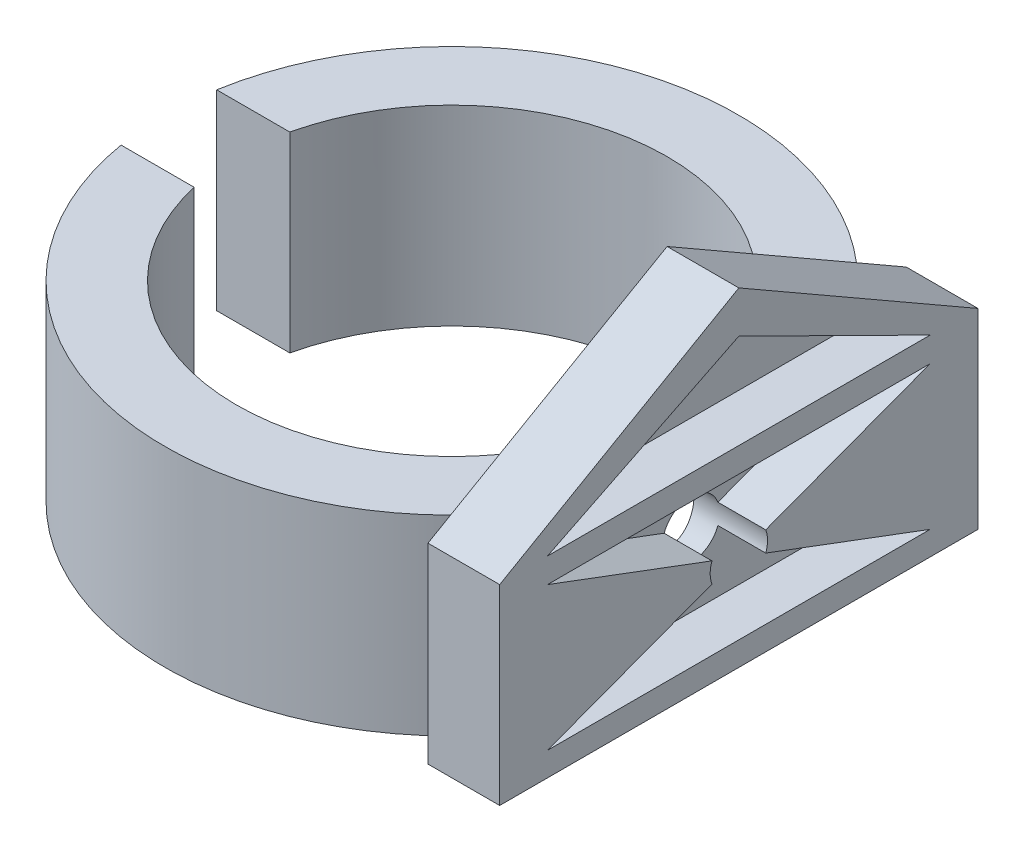
ISO-10303-21;
HEADER;
FILE_DESCRIPTION(('STEP AP214'),'2;1');
FILE_NAME('part.step','',(''),(''),'','','');
FILE_SCHEMA(('AUTOMOTIVE_DESIGN { 1 0 10303 214 1 1 1 1 }'));
ENDSEC;
DATA;
#1=APPLICATION_CONTEXT('core data for automotive mechanical design processes');
#2=APPLICATION_PROTOCOL_DEFINITION('international standard','automotive_design',2000,#1);
#3=PRODUCT_CONTEXT('',#1,'mechanical');
#4=PRODUCT('Part','Part','',(#3));
#5=PRODUCT_RELATED_PRODUCT_CATEGORY('part','',(#4));
#6=PRODUCT_DEFINITION_FORMATION('','',#4);
#7=PRODUCT_DEFINITION_CONTEXT('part definition',#1,'design');
#8=PRODUCT_DEFINITION('design','',#6,#7);
#9=PRODUCT_DEFINITION_SHAPE('','',#8);
#10=(LENGTH_UNIT() NAMED_UNIT(*) SI_UNIT(.MILLI.,.METRE.));
#11=(NAMED_UNIT(*) PLANE_ANGLE_UNIT() SI_UNIT($,.RADIAN.));
#12=(NAMED_UNIT(*) SI_UNIT($,.STERADIAN.) SOLID_ANGLE_UNIT());
#13=UNCERTAINTY_MEASURE_WITH_UNIT(LENGTH_MEASURE(1.E-05),#10,'distance_accuracy_value','');
#14=(GEOMETRIC_REPRESENTATION_CONTEXT(3) GLOBAL_UNCERTAINTY_ASSIGNED_CONTEXT((#13)) GLOBAL_UNIT_ASSIGNED_CONTEXT((#10,
#11,#12)) REPRESENTATION_CONTEXT('',''));
#15=CARTESIAN_POINT('',(0.,0.,0.));
#16=DIRECTION('',(0.,0.,1.));
#17=DIRECTION('',(1.,0.,0.));
#18=AXIS2_PLACEMENT_3D('',#15,#16,#17);
#19=CARTESIAN_POINT('',(0.,20.,0.));
#20=DIRECTION('',(0.,1.,0.));
#21=DIRECTION('',(0.,0.,1.));
#22=AXIS2_PLACEMENT_3D('',#19,#20,#21);
#23=PLANE('',#22);
#24=CARTESIAN_POINT('',(0.,20.,0.));
#25=DIRECTION('',(0.,1.,0.));
#26=DIRECTION('',(0.,0.,1.));
#27=AXIS2_PLACEMENT_3D('',#24,#25,#26);
#28=CIRCLE('',#27,30.);
#29=CARTESIAN_POINT('',(-29.5803989154981,20.,5.));
#30=VERTEX_POINT('',#29);
#31=CARTESIAN_POINT('',(22.5,20.,19.8431348329844));
#32=VERTEX_POINT('',#31);
#33=EDGE_CURVE('E356',#30,#32,#28,.T.);
#34=ORIENTED_EDGE('',*,*,#33,.T.);
#35=DIRECTION('',(0.,0.,-1.));
#36=VECTOR('',#35,1.);
#37=CARTESIAN_POINT('',(22.5,20.,25.));
#38=LINE('',#37,#36);
#39=CARTESIAN_POINT('',(22.5,20.,0.));
#40=VERTEX_POINT('',#39);
#41=EDGE_CURVE('E11',#32,#40,#38,.T.);
#42=ORIENTED_EDGE('',*,*,#41,.T.);
#43=CARTESIAN_POINT('',(0.,20.,0.));
#44=DIRECTION('',(0.,1.,0.));
#45=DIRECTION('',(0.,0.,1.));
#46=AXIS2_PLACEMENT_3D('',#43,#44,#45);
#47=CIRCLE('',#46,22.5);
#48=CARTESIAN_POINT('',(-21.9374109684803,20.,5.));
#49=VERTEX_POINT('',#48);
#50=EDGE_CURVE('E361',#49,#40,#47,.T.);
#51=ORIENTED_EDGE('',*,*,#50,.F.);
#52=DIRECTION('',(1.,0.,0.));
#53=VECTOR('',#52,1.);
#54=CARTESIAN_POINT('',(-33.9901992769391,20.,5.));
#55=LINE('',#54,#53);
#56=EDGE_CURVE('E391',#30,#49,#55,.T.);
#57=ORIENTED_EDGE('',*,*,#56,.F.);
#58=EDGE_LOOP('',(#34,#42,#51,#57));
#59=FACE_BOUND('',#58,.T.);
#60=ADVANCED_FACE('F32',(#59),#23,.T.);
#61=CARTESIAN_POINT('',(-21.9374109684803,20.,-5.));
#62=VERTEX_POINT('',#61);
#63=EDGE_CURVE('E375',#40,#62,#47,.T.);
#64=ORIENTED_EDGE('',*,*,#63,.F.);
#65=CARTESIAN_POINT('',(22.5,20.,-19.8431348329844));
#66=VERTEX_POINT('',#65);
#67=EDGE_CURVE('E41',#40,#66,#38,.T.);
#68=ORIENTED_EDGE('',*,*,#67,.T.);
#69=CARTESIAN_POINT('',(-29.5803989154981,20.,-5.));
#70=VERTEX_POINT('',#69);
#71=EDGE_CURVE('E359',#66,#70,#28,.T.);
#72=ORIENTED_EDGE('',*,*,#71,.T.);
#73=DIRECTION('',(-1.,0.,0.));
#74=VECTOR('',#73,1.);
#75=CARTESIAN_POINT('',(-33.9901992769391,20.,-5.));
#76=LINE('',#75,#74);
#77=EDGE_CURVE('E390',#62,#70,#76,.T.);
#78=ORIENTED_EDGE('',*,*,#77,.F.);
#79=EDGE_LOOP('',(#64,#68,#72,#78));
#80=FACE_BOUND('',#79,.T.);
#81=ADVANCED_FACE('F320',(#80),#23,.T.);
#82=CARTESIAN_POINT('',(25.,0.,0.));
#83=DIRECTION('',(1.,0.,0.));
#84=DIRECTION('',(0.,0.,-1.));
#85=AXIS2_PLACEMENT_3D('',#82,#83,#84);
#86=PLANE('',#85);
#87=CARTESIAN_POINT('',(25.,10.,-2.09488880330588E-13));
#88=DIRECTION('',(1.,0.,0.));
#89=DIRECTION('',(0.,0.,-1.));
#90=AXIS2_PLACEMENT_3D('',#87,#88,#89);
#91=CIRCLE('',#90,3.);
#92=CARTESIAN_POINT('',(25.,11.0533703247652,-2.80898753270732));
#93=VERTEX_POINT('',#92);
#94=CARTESIAN_POINT('',(25.,11.0533703247651,2.80898753270695));
#95=VERTEX_POINT('',#94);
#96=EDGE_CURVE('E368',#93,#95,#91,.T.);
#97=ORIENTED_EDGE('',*,*,#96,.F.);
#98=DIRECTION('',(0.,0.351123441588392,-0.936329177569044));
#99=VECTOR('',#98,1.);
#100=CARTESIAN_POINT('',(25.,17.5,-20.));
#101=LINE('',#100,#99);
#102=CARTESIAN_POINT('',(25.,17.5,-20.));
#103=VERTEX_POINT('',#102);
#104=EDGE_CURVE('E614',#93,#103,#101,.T.);
#105=ORIENTED_EDGE('',*,*,#104,.T.);
#106=DIRECTION('',(0.,0.,1.));
#107=VECTOR('',#106,1.);
#108=CARTESIAN_POINT('',(25.,17.5,-20.));
#109=LINE('',#108,#107);
#110=CARTESIAN_POINT('',(25.,17.5,20.));
#111=VERTEX_POINT('',#110);
#112=EDGE_CURVE('E621',#103,#111,#109,.T.);
#113=ORIENTED_EDGE('',*,*,#112,.T.);
#114=DIRECTION('',(0.,-0.351123441588391,-0.936329177569045));
#115=VECTOR('',#114,1.);
#116=CARTESIAN_POINT('',(25.,10.375,1.));
#117=LINE('',#116,#115);
#118=EDGE_CURVE('E251',#111,#95,#117,.T.);
#119=ORIENTED_EDGE('',*,*,#118,.T.);
#120=EDGE_LOOP('',(#97,#105,#113,#119));
#121=FACE_BOUND('',#120,.T.);
#122=ADVANCED_FACE('F271',(#121),#86,.T.);
#123=CARTESIAN_POINT('',(0.,20.,0.));
#124=DIRECTION('',(0.,-1.,0.));
#125=DIRECTION('',(0.,0.,-1.));
#126=AXIS2_PLACEMENT_3D('',#123,#124,#125);
#127=CYLINDRICAL_SURFACE('',#126,30.);
#128=DIRECTION('',(0.,-1.,0.));
#129=VECTOR('',#128,1.);
#130=CARTESIAN_POINT('',(-29.5803989154981,20.,-5.));
#131=LINE('',#130,#129);
#132=CARTESIAN_POINT('',(-29.5803989154981,0.,-5.));
#133=VERTEX_POINT('',#132);
#134=EDGE_CURVE('E353',#70,#133,#131,.T.);
#135=ORIENTED_EDGE('',*,*,#134,.F.);
#136=ORIENTED_EDGE('',*,*,#71,.F.);
#137=DIRECTION('',(0.,-1.,0.));
#138=VECTOR('',#137,1.);
#139=CARTESIAN_POINT('',(22.5,20.,-19.8431348329844));
#140=LINE('',#139,#138);
#141=CARTESIAN_POINT('',(22.5,0.,-19.8431348329844));
#142=VERTEX_POINT('',#141);
#143=EDGE_CURVE('E355',#142,#66,#140,.F.);
#144=ORIENTED_EDGE('',*,*,#143,.F.);
#145=CARTESIAN_POINT('',(0.,0.,0.));
#146=DIRECTION('',(0.,1.,0.));
#147=DIRECTION('',(0.,0.,1.));
#148=AXIS2_PLACEMENT_3D('',#145,#146,#147);
#149=CIRCLE('',#148,30.);
#150=EDGE_CURVE('E340',#142,#133,#149,.T.);
#151=ORIENTED_EDGE('',*,*,#150,.T.);
#152=EDGE_LOOP('',(#135,#136,#144,#151));
#153=FACE_BOUND('',#152,.T.);
#154=ADVANCED_FACE('F34',(#153),#127,.T.);
#155=DIRECTION('',(0.,-1.,0.));
#156=VECTOR('',#155,1.);
#157=CARTESIAN_POINT('',(-29.5803989154981,20.,5.));
#158=LINE('',#157,#156);
#159=CARTESIAN_POINT('',(-29.5803989154981,0.,5.));
#160=VERTEX_POINT('',#159);
#161=EDGE_CURVE('E393',#160,#30,#158,.F.);
#162=ORIENTED_EDGE('',*,*,#161,.F.);
#163=CARTESIAN_POINT('',(22.5,0.,19.8431348329844));
#164=VERTEX_POINT('',#163);
#165=EDGE_CURVE('E357',#160,#164,#149,.T.);
#166=ORIENTED_EDGE('',*,*,#165,.T.);
#167=DIRECTION('',(0.,-1.,0.));
#168=VECTOR('',#167,1.);
#169=CARTESIAN_POINT('',(22.5,20.,19.8431348329844));
#170=LINE('',#169,#168);
#171=EDGE_CURVE('E381',#32,#164,#170,.T.);
#172=ORIENTED_EDGE('',*,*,#171,.F.);
#173=ORIENTED_EDGE('',*,*,#33,.F.);
#174=EDGE_LOOP('',(#162,#166,#172,#173));
#175=FACE_BOUND('',#174,.T.);
#176=ADVANCED_FACE('F327',(#175),#127,.T.);
#177=CARTESIAN_POINT('',(0.,0.,0.));
#178=DIRECTION('',(0.,1.,0.));
#179=DIRECTION('',(0.,0.,1.));
#180=AXIS2_PLACEMENT_3D('',#177,#178,#179);
#181=PLANE('',#180);
#182=DIRECTION('',(-1.,0.,0.));
#183=VECTOR('',#182,1.);
#184=CARTESIAN_POINT('',(-33.9901992769391,0.,-5.));
#185=LINE('',#184,#183);
#186=CARTESIAN_POINT('',(-21.9374109684803,0.,-5.));
#187=VERTEX_POINT('',#186);
#188=EDGE_CURVE('E338',#187,#133,#185,.T.);
#189=ORIENTED_EDGE('',*,*,#188,.T.);
#190=ORIENTED_EDGE('',*,*,#150,.F.);
#191=DIRECTION('',(0.,0.,-1.));
#192=VECTOR('',#191,1.);
#193=CARTESIAN_POINT('',(22.5,0.,25.));
#194=LINE('',#193,#192);
#195=CARTESIAN_POINT('',(22.5,0.,-25.));
#196=VERTEX_POINT('',#195);
#197=EDGE_CURVE('E380',#142,#196,#194,.T.);
#198=ORIENTED_EDGE('',*,*,#197,.T.);
#199=DIRECTION('',(-1.,0.,0.));
#200=VECTOR('',#199,1.);
#201=CARTESIAN_POINT('',(30.,0.,-25.));
#202=LINE('',#201,#200);
#203=CARTESIAN_POINT('',(30.,0.,-25.));
#204=VERTEX_POINT('',#203);
#205=EDGE_CURVE('E410',#204,#196,#202,.T.);
#206=ORIENTED_EDGE('',*,*,#205,.F.);
#207=DIRECTION('',(0.,0.,-1.));
#208=VECTOR('',#207,1.);
#209=CARTESIAN_POINT('',(30.,0.,25.));
#210=LINE('',#209,#208);
#211=CARTESIAN_POINT('',(30.,0.,25.));
#212=VERTEX_POINT('',#211);
#213=EDGE_CURVE('E408',#212,#204,#210,.T.);
#214=ORIENTED_EDGE('',*,*,#213,.F.);
#215=DIRECTION('',(-1.,0.,0.));
#216=VECTOR('',#215,1.);
#217=CARTESIAN_POINT('',(30.,0.,25.));
#218=LINE('',#217,#216);
#219=CARTESIAN_POINT('',(22.5,0.,25.));
#220=VERTEX_POINT('',#219);
#221=EDGE_CURVE('E418',#212,#220,#218,.T.);
#222=ORIENTED_EDGE('',*,*,#221,.T.);
#223=EDGE_CURVE('E406',#220,#164,#194,.T.);
#224=ORIENTED_EDGE('',*,*,#223,.T.);
#225=ORIENTED_EDGE('',*,*,#165,.F.);
#226=DIRECTION('',(1.,0.,0.));
#227=VECTOR('',#226,1.);
#228=CARTESIAN_POINT('',(-33.9901992769391,0.,5.));
#229=LINE('',#228,#227);
#230=CARTESIAN_POINT('',(-21.9374109684803,0.,5.));
#231=VERTEX_POINT('',#230);
#232=EDGE_CURVE('E347',#160,#231,#229,.T.);
#233=ORIENTED_EDGE('',*,*,#232,.T.);
#234=CARTESIAN_POINT('',(0.,0.,0.));
#235=DIRECTION('',(0.,1.,0.));
#236=DIRECTION('',(0.,0.,1.));
#237=AXIS2_PLACEMENT_3D('',#234,#235,#236);
#238=CIRCLE('',#237,22.5);
#239=EDGE_CURVE('E344',#231,#187,#238,.T.);
#240=ORIENTED_EDGE('',*,*,#239,.T.);
#241=EDGE_LOOP('',(#189,#190,#198,#206,#214,#222,#224,#225,#233,#240));
#242=FACE_BOUND('',#241,.T.);
#243=ADVANCED_FACE('F325',(#242),#181,.F.);
#244=CARTESIAN_POINT('',(0.,20.,0.));
#245=DIRECTION('',(0.,-1.,0.));
#246=DIRECTION('',(0.,0.,-1.));
#247=AXIS2_PLACEMENT_3D('',#244,#245,#246);
#248=CYLINDRICAL_SURFACE('',#247,22.5);
#249=CARTESIAN_POINT('',(22.2991031209777,10.,-3.00000000000021));
#250=CARTESIAN_POINT('',(22.2991056676806,9.83229421679777,-2.99999292892204));
#251=CARTESIAN_POINT('',(22.3010154696116,9.66448595032542,-2.98588990056224));
#252=CARTESIAN_POINT('',(22.3084447289533,9.33354630649642,-2.92985694399204));
#253=CARTESIAN_POINT('',(22.3139678794925,9.17041989262426,-2.88789854473687));
#254=CARTESIAN_POINT('',(22.3279873821811,8.85368294766046,-2.7774196671042));
#255=CARTESIAN_POINT('',(22.3364816334313,8.70006578257344,-2.70891795412589));
#256=CARTESIAN_POINT('',(22.3554837337772,8.40653338643568,-2.5473384732105));
#257=CARTESIAN_POINT('',(22.3659912596801,8.26661596159296,-2.45426464895224));
#258=CARTESIAN_POINT('',(22.3879106598111,8.00353981799729,-2.24555055734298));
#259=CARTESIAN_POINT('',(22.399327327406,7.88048070148093,-2.1297852341231));
#260=CARTESIAN_POINT('',(22.4217356438735,7.65547563181543,-1.87924384308936));
#261=CARTESIAN_POINT('',(22.4327272708986,7.55353076278571,-1.74446679970818));
#262=CARTESIAN_POINT('',(22.4530964964055,7.37328723742539,-1.45909758739163));
#263=CARTESIAN_POINT('',(22.4624678475342,7.29507926606463,-1.30844765656704));
#264=CARTESIAN_POINT('',(22.4784878012371,7.1651107537288,-0.996005724056261));
#265=CARTESIAN_POINT('',(22.4851365182189,7.11334910143348,-0.834214190883811));
#266=CARTESIAN_POINT('',(22.4949282929341,7.0380416356296,-0.505103062521344));
#267=CARTESIAN_POINT('',(22.4980919730761,7.01432977748207,-0.337822085205056));
#268=CARTESIAN_POINT('',(22.5006277195728,6.99528008689477,-0.00162750345569448));
#269=CARTESIAN_POINT('',(22.4999999544425,6.99994099339522,0.16728602808349));
#270=CARTESIAN_POINT('',(22.4950401617536,7.03737209581142,0.500820186698445));
#271=CARTESIAN_POINT('',(22.4907316700671,7.06996369711847,0.665461256042468));
#272=CARTESIAN_POINT('',(22.4789208613843,7.16205149053226,0.986916184068623));
#273=CARTESIAN_POINT('',(22.4714184767105,7.22154825275217,1.14372987681255));
#274=CARTESIAN_POINT('',(22.4540222850625,7.36594516168273,1.44562771263598));
#275=CARTESIAN_POINT('',(22.4441212821882,7.45092193477462,1.59067477402968));
#276=CARTESIAN_POINT('',(22.4230342562856,7.64381088592428,1.86451753610197));
#277=CARTESIAN_POINT('',(22.4118481662644,7.7517242599417,1.99331238880002));
#278=CARTESIAN_POINT('',(22.3893388214349,7.98842177253839,2.23204509231787));
#279=CARTESIAN_POINT('',(22.378015176366,8.11736165229045,2.34182855029511));
#280=CARTESIAN_POINT('',(22.3565924815386,8.39191889705886,2.53822039585766));
#281=CARTESIAN_POINT('',(22.3464934366361,8.53753632820445,2.62482869154509));
#282=CARTESIAN_POINT('',(22.3286636450151,8.84146000052005,2.77242429129729));
#283=CARTESIAN_POINT('',(22.3209341432218,8.99977285677773,2.83339813360039));
#284=CARTESIAN_POINT('',(22.3087421319858,9.32451703095756,2.92785135067365));
#285=CARTESIAN_POINT('',(22.3042794425425,9.49094790103984,2.96133224031194));
#286=CARTESIAN_POINT('',(22.2991596751552,9.82583700250744,2.9996424115307));
#287=CARTESIAN_POINT('',(22.2984736726745,9.9942698954988,3.00468946648197));
#288=CARTESIAN_POINT('',(22.3009083644505,10.3295788841571,2.98656432283173));
#289=CARTESIAN_POINT('',(22.3040289660713,10.4964550176092,2.96339281094644));
#290=CARTESIAN_POINT('',(22.3136988065516,10.8232539796084,2.88967207555508));
#291=CARTESIAN_POINT('',(22.3202347168148,10.9832012395272,2.83922925485019));
#292=CARTESIAN_POINT('',(22.3359878852161,11.2923683701787,2.71250767620167));
#293=CARTESIAN_POINT('',(22.3452052497427,11.4415878149856,2.63622789314054));
#294=CARTESIAN_POINT('',(22.3653516992928,11.7260459656612,2.45946609625795));
#295=CARTESIAN_POINT('',(22.376290706837,11.8611955725524,2.3588418474943));
#296=CARTESIAN_POINT('',(22.3986171527477,12.1127664076556,2.13644748469177));
#297=CARTESIAN_POINT('',(22.410004610999,12.229186804222,2.0146764321561));
#298=CARTESIAN_POINT('',(22.43203422983,12.4407648308817,1.75249132253715));
#299=CARTESIAN_POINT('',(22.4426710507458,12.5357789745574,1.61196096139858));
#300=CARTESIAN_POINT('',(22.4619201221746,12.700852423263,1.31680867847622));
#301=CARTESIAN_POINT('',(22.4705324182274,12.7709122896342,1.16218707377034));
#302=CARTESIAN_POINT('',(22.4847384703673,12.8838538923822,0.843709158784941));
#303=CARTESIAN_POINT('',(22.4903412723117,12.9268171436253,0.679882176370834));
#304=CARTESIAN_POINT('',(22.4979347502993,12.9846107281915,0.347259740134587));
#305=CARTESIAN_POINT('',(22.499925612842,12.9994425140616,0.178464543299523));
#306=CARTESIAN_POINT('',(22.5000697087262,13.0005224008605,-0.157904810567589));
#307=CARTESIAN_POINT('',(22.4982525737009,12.9869912058916,-0.325478288883018));
#308=CARTESIAN_POINT('',(22.4910439982984,12.932198438152,-0.655946164578749));
#309=CARTESIAN_POINT('',(22.485652562927,12.890936904218,-0.818840568511819));
#310=CARTESIAN_POINT('',(22.4718983496352,12.7819269293851,-1.13528735188346));
#311=CARTESIAN_POINT('',(22.4635369261179,12.7141905603882,-1.28884395231592));
#312=CARTESIAN_POINT('',(22.4447662409466,12.5541766755311,-1.58244611794667));
#313=CARTESIAN_POINT('',(22.4343569414803,12.4618987065202,-1.72249143359952));
#314=CARTESIAN_POINT('',(22.4125543681221,12.2546099769957,-1.98622092909975));
#315=CARTESIAN_POINT('',(22.4011543544026,12.1394353147957,-2.10977573574409));
#316=CARTESIAN_POINT('',(22.3787079735476,11.8899653964245,-2.33588843381057));
#317=CARTESIAN_POINT('',(22.3676616905097,11.7556656341014,-2.43844136296158));
#318=CARTESIAN_POINT('',(22.3471216479154,11.4710740876578,-2.62003186467137));
#319=CARTESIAN_POINT('',(22.337634925064,11.3207146127921,-2.69896410641032));
#320=CARTESIAN_POINT('',(22.3213704974611,11.0088272987819,-2.83034277419589));
#321=CARTESIAN_POINT('',(22.3145898900774,10.8473116453756,-2.8828175949895));
#322=CARTESIAN_POINT('',(22.3061270075485,10.5708275819042,-2.94743220568259));
#323=CARTESIAN_POINT('',(22.3035064293224,10.4575925905458,-2.96711622203823));
#324=CARTESIAN_POINT('',(22.2999936221278,10.2295877357963,-2.99340248014695));
#325=CARTESIAN_POINT('',(22.2991013774062,10.1148178864045,-3.00000484113469));
#326=CARTESIAN_POINT('',(22.2991031209777,10.,-3.00000000000021));
#327=B_SPLINE_CURVE_WITH_KNOTS('',3,(#249,#250,#251,#252,#253,#254,#255,#256,#257,#258,#259,
#260,#261,#262,#263,#264,#265,#266,#267,#268,#269,#270,#271,#272,#273,#274,#275,#276,#277,#278,
#279,#280,#281,#282,#283,#284,#285,#286,#287,#288,#289,#290,#291,#292,#293,#294,#295,#296,#297,
#298,#299,#300,#301,#302,#303,#304,#305,#306,#307,#308,#309,#310,#311,#312,#313,#314,#315,#316,
#317,#318,#319,#320,#321,#322,#323,#324,#325,#326),.UNSPECIFIED.,.T.,.F.,(4,2,2,2,2,2,2,2,2,2,2,
2,2,2,2,2,2,2,2,2,2,2,2,2,2,2,2,2,2,2,2,2,2,2,2,2,2,2,4),(0.,0.502697833875671,1.00591026915852,
1.50876759415237,2.01154426252434,2.51717392681748,3.02282954643357,3.5303933478772,
4.03793581885392,4.54245854287453,5.04695884297285,5.54825713004929,6.04956604000018,
6.55239792684377,7.05525603876943,7.56202372603438,8.06879342278636,8.57582891483611,
9.08283646723652,9.58595553872895,10.0890623667531,10.5902202722789,11.0913980642731,
11.595577922135,12.0997801612593,12.6072676764676,13.1147437751273,13.620685856555,
14.1266018133322,14.6285956478445,15.1305887793096,15.6323532802529,16.1341270467162,
16.6396311355341,17.145254526141,17.6531001297407,18.1603995347189,18.5045691141841,
18.8487355566504),.UNSPECIFIED.);
#328=CARTESIAN_POINT('',(22.2991031209777,10.,-3.00000000000021));
#329=VERTEX_POINT('',#328);
#330=EDGE_CURVE('E243',#329,#329,#327,.T.);
#331=ORIENTED_EDGE('',*,*,#330,.F.);
#332=EDGE_LOOP('',(#331));
#333=FACE_BOUND('',#332,.T.);
#334=ORIENTED_EDGE('',*,*,#50,.T.);
#335=ORIENTED_EDGE('',*,*,#63,.T.);
#336=DIRECTION('',(0.,-1.,0.));
#337=VECTOR('',#336,1.);
#338=CARTESIAN_POINT('',(-21.9374109684803,20.,-5.));
#339=LINE('',#338,#337);
#340=EDGE_CURVE('E366',#62,#187,#339,.T.);
#341=ORIENTED_EDGE('',*,*,#340,.T.);
#342=ORIENTED_EDGE('',*,*,#239,.F.);
#343=DIRECTION('',(0.,-1.,0.));
#344=VECTOR('',#343,1.);
#345=CARTESIAN_POINT('',(-21.9374109684803,20.,5.));
#346=LINE('',#345,#344);
#347=EDGE_CURVE('E364',#231,#49,#346,.F.);
#348=ORIENTED_EDGE('',*,*,#347,.T.);
#349=EDGE_LOOP('',(#334,#335,#341,#342,#348));
#350=FACE_BOUND('',#349,.T.);
#351=ADVANCED_FACE('F253',(#333,#350),#248,.F.);
#352=CARTESIAN_POINT('',(30.,0.,0.));
#353=DIRECTION('',(1.,0.,0.));
#354=DIRECTION('',(0.,0.,-1.));
#355=AXIS2_PLACEMENT_3D('',#352,#353,#354);
#356=PLANE('',#355);
#357=DIRECTION('',(0.,-0.443717317072408,0.896166805081545));
#358=VECTOR('',#357,1.);
#359=CARTESIAN_POINT('',(30.,29.9909641759337,0.));
#360=LINE('',#359,#358);
#361=CARTESIAN_POINT('',(30.,29.9909641759337,0.));
#362=VERTEX_POINT('',#361);
#363=CARTESIAN_POINT('',(30.,20.0884033009629,20.));
#364=VERTEX_POINT('',#363);
#365=EDGE_CURVE('E49',#362,#364,#360,.T.);
#366=ORIENTED_EDGE('',*,*,#365,.F.);
#367=DIRECTION('',(0.,0.443717317072408,0.896166805081545));
#368=VECTOR('',#367,1.);
#369=CARTESIAN_POINT('',(30.,20.0884033009629,-20.));
#370=LINE('',#369,#368);
#371=CARTESIAN_POINT('',(30.,20.0884033009629,-20.));
#372=VERTEX_POINT('',#371);
#373=EDGE_CURVE('E202',#372,#362,#370,.T.);
#374=ORIENTED_EDGE('',*,*,#373,.F.);
#375=DIRECTION('',(0.,0.,-1.));
#376=VECTOR('',#375,1.);
#377=CARTESIAN_POINT('',(30.,20.0884033009629,20.));
#378=LINE('',#377,#376);
#379=EDGE_CURVE('E205',#364,#372,#378,.T.);
#380=ORIENTED_EDGE('',*,*,#379,.F.);
#381=EDGE_LOOP('',(#366,#374,#380));
#382=FACE_BOUND('',#381,.T.);
#383=CARTESIAN_POINT('',(30.,10.,-2.09488880330588E-13));
#384=DIRECTION('',(1.,0.,0.));
#385=DIRECTION('',(0.,0.,-1.));
#386=AXIS2_PLACEMENT_3D('',#383,#384,#385);
#387=CIRCLE('',#386,3.);
#388=CARTESIAN_POINT('',(30.,11.0533703247651,2.80898753270695));
#389=VERTEX_POINT('',#388);
#390=CARTESIAN_POINT('',(30.,8.94662967523489,2.80898753270695));
#391=VERTEX_POINT('',#390);
#392=EDGE_CURVE('E230',#389,#391,#387,.T.);
#393=ORIENTED_EDGE('',*,*,#392,.F.);
#394=DIRECTION('',(0.,-0.351123441588391,-0.936329177569045));
#395=VECTOR('',#394,1.);
#396=CARTESIAN_POINT('',(30.,10.375,1.));
#397=LINE('',#396,#395);
#398=CARTESIAN_POINT('',(30.,17.5,20.));
#399=VERTEX_POINT('',#398);
#400=EDGE_CURVE('E250',#399,#389,#397,.T.);
#401=ORIENTED_EDGE('',*,*,#400,.F.);
#402=DIRECTION('',(0.,0.,1.));
#403=VECTOR('',#402,1.);
#404=CARTESIAN_POINT('',(30.,17.5,-20.));
#405=LINE('',#404,#403);
#406=CARTESIAN_POINT('',(30.,17.5,-20.));
#407=VERTEX_POINT('',#406);
#408=EDGE_CURVE('E642',#407,#399,#405,.T.);
#409=ORIENTED_EDGE('',*,*,#408,.F.);
#410=DIRECTION('',(0.,0.351123441588392,-0.936329177569044));
#411=VECTOR('',#410,1.);
#412=CARTESIAN_POINT('',(30.,17.5,-20.));
#413=LINE('',#412,#411);
#414=CARTESIAN_POINT('',(30.,11.0533703247652,-2.80898753270732));
#415=VERTEX_POINT('',#414);
#416=EDGE_CURVE('E640',#415,#407,#413,.T.);
#417=ORIENTED_EDGE('',*,*,#416,.F.);
#418=CARTESIAN_POINT('',(30.,8.94662967523475,-2.80898753270732));
#419=VERTEX_POINT('',#418);
#420=EDGE_CURVE('E228',#419,#415,#387,.T.);
#421=ORIENTED_EDGE('',*,*,#420,.F.);
#422=DIRECTION('',(0.,0.351123441588391,0.936329177569045));
#423=VECTOR('',#422,1.);
#424=CARTESIAN_POINT('',(30.,2.5,-20.));
#425=LINE('',#424,#423);
#426=CARTESIAN_POINT('',(30.,2.5,-20.));
#427=VERTEX_POINT('',#426);
#428=EDGE_CURVE('E637',#427,#419,#425,.T.);
#429=ORIENTED_EDGE('',*,*,#428,.F.);
#430=DIRECTION('',(0.,0.,-1.));
#431=VECTOR('',#430,1.);
#432=CARTESIAN_POINT('',(30.,2.5,-20.));
#433=LINE('',#432,#431);
#434=CARTESIAN_POINT('',(30.,2.5,20.));
#435=VERTEX_POINT('',#434);
#436=EDGE_CURVE('E634',#435,#427,#433,.T.);
#437=ORIENTED_EDGE('',*,*,#436,.F.);
#438=DIRECTION('',(0.,-0.351123441588392,0.936329177569044));
#439=VECTOR('',#438,1.);
#440=CARTESIAN_POINT('',(30.,9.625,1.));
#441=LINE('',#440,#439);
#442=EDGE_CURVE('E632',#391,#435,#441,.T.);
#443=ORIENTED_EDGE('',*,*,#442,.F.);
#444=EDGE_LOOP('',(#393,#401,#409,#417,#421,#429,#437,#443));
#445=FACE_BOUND('',#444,.T.);
#446=ORIENTED_EDGE('',*,*,#213,.T.);
#447=DIRECTION('',(0.,1.,0.));
#448=VECTOR('',#447,1.);
#449=CARTESIAN_POINT('',(30.,20.,-25.));
#450=LINE('',#449,#448);
#451=CARTESIAN_POINT('',(30.,20.,-25.));
#452=VERTEX_POINT('',#451);
#453=EDGE_CURVE('E403',#204,#452,#450,.T.);
#454=ORIENTED_EDGE('',*,*,#453,.T.);
#455=DIRECTION('',(0.,0.498021777066641,0.867164522779492));
#456=VECTOR('',#455,1.);
#457=CARTESIAN_POINT('',(30.,20.,-25.));
#458=LINE('',#457,#456);
#459=CARTESIAN_POINT('',(30.,34.3577649910753,-2.09488880330588E-13));
#460=VERTEX_POINT('',#459);
#461=EDGE_CURVE('E213',#452,#460,#458,.T.);
#462=ORIENTED_EDGE('',*,*,#461,.T.);
#463=DIRECTION('',(0.,-0.498021777066635,0.867164522779496));
#464=VECTOR('',#463,1.);
#465=CARTESIAN_POINT('',(30.,20.,25.));
#466=LINE('',#465,#464);
#467=CARTESIAN_POINT('',(30.,20.,25.));
#468=VERTEX_POINT('',#467);
#469=EDGE_CURVE('E219',#460,#468,#466,.T.);
#470=ORIENTED_EDGE('',*,*,#469,.T.);
#471=DIRECTION('',(0.,-1.,0.));
#472=VECTOR('',#471,1.);
#473=CARTESIAN_POINT('',(30.,20.,25.));
#474=LINE('',#473,#472);
#475=EDGE_CURVE('E405',#468,#212,#474,.T.);
#476=ORIENTED_EDGE('',*,*,#475,.T.);
#477=EDGE_LOOP('',(#446,#454,#462,#470,#476));
#478=FACE_BOUND('',#477,.T.);
#479=ADVANCED_FACE('F304',(#382,#445,#478),#356,.T.);
#480=CARTESIAN_POINT('',(22.5,0.,0.));
#481=DIRECTION('',(1.,0.,0.));
#482=DIRECTION('',(0.,0.,-1.));
#483=AXIS2_PLACEMENT_3D('',#480,#481,#482);
#484=PLANE('',#483);
#485=DIRECTION('',(0.,-1.,0.));
#486=VECTOR('',#485,1.);
#487=CARTESIAN_POINT('',(22.5,20.,25.));
#488=LINE('',#487,#486);
#489=CARTESIAN_POINT('',(22.5,20.,25.));
#490=VERTEX_POINT('',#489);
#491=EDGE_CURVE('E412',#490,#220,#488,.T.);
#492=ORIENTED_EDGE('',*,*,#491,.F.);
#493=DIRECTION('',(0.,-0.498021777066635,0.867164522779496));
#494=VECTOR('',#493,1.);
#495=CARTESIAN_POINT('',(22.5,20.,25.));
#496=LINE('',#495,#494);
#497=CARTESIAN_POINT('',(22.5,34.3577649910753,-2.09488880330588E-13));
#498=VERTEX_POINT('',#497);
#499=EDGE_CURVE('E218',#498,#490,#496,.T.);
#500=ORIENTED_EDGE('',*,*,#499,.F.);
#501=DIRECTION('',(0.,0.498021777066641,0.867164522779492));
#502=VECTOR('',#501,1.);
#503=CARTESIAN_POINT('',(22.5,20.,-25.));
#504=LINE('',#503,#502);
#505=CARTESIAN_POINT('',(22.5,20.,-25.));
#506=VERTEX_POINT('',#505);
#507=EDGE_CURVE('E215',#506,#498,#504,.T.);
#508=ORIENTED_EDGE('',*,*,#507,.F.);
#509=DIRECTION('',(0.,1.,0.));
#510=VECTOR('',#509,1.);
#511=CARTESIAN_POINT('',(22.5,20.,-25.));
#512=LINE('',#511,#510);
#513=EDGE_CURVE('E402',#196,#506,#512,.T.);
#514=ORIENTED_EDGE('',*,*,#513,.F.);
#515=ORIENTED_EDGE('',*,*,#197,.F.);
#516=ORIENTED_EDGE('',*,*,#143,.T.);
#517=ORIENTED_EDGE('',*,*,#67,.F.);
#518=ORIENTED_EDGE('',*,*,#41,.F.);
#519=ORIENTED_EDGE('',*,*,#171,.T.);
#520=ORIENTED_EDGE('',*,*,#223,.F.);
#521=EDGE_LOOP('',(#492,#500,#508,#514,#515,#516,#517,#518,#519,#520));
#522=FACE_BOUND('',#521,.T.);
#523=ADVANCED_FACE('F307',(#522),#484,.F.);
#524=CARTESIAN_POINT('',(30.,20.,-25.));
#525=DIRECTION('',(0.,0.,1.));
#526=DIRECTION('',(1.,0.,0.));
#527=AXIS2_PLACEMENT_3D('',#524,#525,#526);
#528=PLANE('',#527);
#529=ORIENTED_EDGE('',*,*,#513,.T.);
#530=DIRECTION('',(-1.,0.,0.));
#531=VECTOR('',#530,1.);
#532=CARTESIAN_POINT('',(30.,20.,-25.));
#533=LINE('',#532,#531);
#534=EDGE_CURVE('E382',#452,#506,#533,.T.);
#535=ORIENTED_EDGE('',*,*,#534,.F.);
#536=ORIENTED_EDGE('',*,*,#453,.F.);
#537=ORIENTED_EDGE('',*,*,#205,.T.);
#538=EDGE_LOOP('',(#529,#535,#536,#537));
#539=FACE_BOUND('',#538,.T.);
#540=ADVANCED_FACE('F311',(#539),#528,.F.);
#541=CARTESIAN_POINT('',(30.,20.,25.));
#542=DIRECTION('',(0.,0.,-1.));
#543=DIRECTION('',(-1.,0.,0.));
#544=AXIS2_PLACEMENT_3D('',#541,#542,#543);
#545=PLANE('',#544);
#546=ORIENTED_EDGE('',*,*,#491,.T.);
#547=ORIENTED_EDGE('',*,*,#221,.F.);
#548=ORIENTED_EDGE('',*,*,#475,.F.);
#549=DIRECTION('',(-1.,0.,0.));
#550=VECTOR('',#549,1.);
#551=CARTESIAN_POINT('',(30.,20.,25.));
#552=LINE('',#551,#550);
#553=EDGE_CURVE('E386',#468,#490,#552,.T.);
#554=ORIENTED_EDGE('',*,*,#553,.T.);
#555=EDGE_LOOP('',(#546,#547,#548,#554));
#556=FACE_BOUND('',#555,.T.);
#557=ADVANCED_FACE('F299',(#556),#545,.F.);
#558=CARTESIAN_POINT('',(-33.9901992769391,20.,5.));
#559=DIRECTION('',(0.,0.,-1.));
#560=DIRECTION('',(-1.,0.,0.));
#561=AXIS2_PLACEMENT_3D('',#558,#559,#560);
#562=PLANE('',#561);
#563=ORIENTED_EDGE('',*,*,#161,.T.);
#564=ORIENTED_EDGE('',*,*,#56,.T.);
#565=ORIENTED_EDGE('',*,*,#347,.F.);
#566=ORIENTED_EDGE('',*,*,#232,.F.);
#567=EDGE_LOOP('',(#563,#564,#565,#566));
#568=FACE_BOUND('',#567,.T.);
#569=ADVANCED_FACE('F296',(#568),#562,.T.);
#570=CARTESIAN_POINT('',(-33.9901992769391,20.,-5.));
#571=DIRECTION('',(0.,0.,1.));
#572=DIRECTION('',(1.,0.,0.));
#573=AXIS2_PLACEMENT_3D('',#570,#571,#572);
#574=PLANE('',#573);
#575=ORIENTED_EDGE('',*,*,#134,.T.);
#576=ORIENTED_EDGE('',*,*,#188,.F.);
#577=ORIENTED_EDGE('',*,*,#340,.F.);
#578=ORIENTED_EDGE('',*,*,#77,.T.);
#579=EDGE_LOOP('',(#575,#576,#577,#578));
#580=FACE_BOUND('',#579,.T.);
#581=ADVANCED_FACE('F294',(#580),#574,.T.);
#582=CARTESIAN_POINT('',(25.,10.375,1.));
#583=DIRECTION('',(0.,-0.936329177569044,0.351123441588391));
#584=DIRECTION('',(0.,-0.351123441588391,-0.936329177569045));
#585=AXIS2_PLACEMENT_3D('',#582,#583,#584);
#586=PLANE('',#585);
#587=ORIENTED_EDGE('',*,*,#400,.T.);
#588=DIRECTION('',(1.,0.,0.));
#589=VECTOR('',#588,1.);
#590=CARTESIAN_POINT('',(20.,11.0533703247651,2.80898753270695));
#591=LINE('',#590,#589);
#592=EDGE_CURVE('E240',#389,#95,#591,.F.);
#593=ORIENTED_EDGE('',*,*,#592,.T.);
#594=ORIENTED_EDGE('',*,*,#118,.F.);
#595=DIRECTION('',(1.,0.,0.));
#596=VECTOR('',#595,1.);
#597=CARTESIAN_POINT('',(25.,17.5,20.));
#598=LINE('',#597,#596);
#599=EDGE_CURVE('E348',#111,#399,#598,.T.);
#600=ORIENTED_EDGE('',*,*,#599,.T.);
#601=EDGE_LOOP('',(#587,#593,#594,#600));
#602=FACE_BOUND('',#601,.T.);
#603=ADVANCED_FACE('F276',(#602),#586,.F.);
#604=CARTESIAN_POINT('',(25.,17.5,-20.));
#605=DIRECTION('',(0.,1.,0.));
#606=DIRECTION('',(0.,0.,1.));
#607=AXIS2_PLACEMENT_3D('',#604,#605,#606);
#608=PLANE('',#607);
#609=ORIENTED_EDGE('',*,*,#408,.T.);
#610=ORIENTED_EDGE('',*,*,#599,.F.);
#611=ORIENTED_EDGE('',*,*,#112,.F.);
#612=DIRECTION('',(1.,0.,0.));
#613=VECTOR('',#612,1.);
#614=CARTESIAN_POINT('',(25.,17.5,-20.));
#615=LINE('',#614,#613);
#616=EDGE_CURVE('E619',#103,#407,#615,.T.);
#617=ORIENTED_EDGE('',*,*,#616,.T.);
#618=EDGE_LOOP('',(#609,#610,#611,#617));
#619=FACE_BOUND('',#618,.T.);
#620=ADVANCED_FACE('F272',(#619),#608,.F.);
#621=CARTESIAN_POINT('',(25.,17.5,-20.));
#622=DIRECTION('',(0.,-0.936329177569045,-0.351123441588392));
#623=DIRECTION('',(0.,0.351123441588392,-0.936329177569045));
#624=AXIS2_PLACEMENT_3D('',#621,#622,#623);
#625=PLANE('',#624);
#626=ORIENTED_EDGE('',*,*,#104,.F.);
#627=DIRECTION('',(1.,0.,0.));
#628=VECTOR('',#627,1.);
#629=CARTESIAN_POINT('',(20.,11.0533703247652,-2.80898753270732));
#630=LINE('',#629,#628);
#631=EDGE_CURVE('E237',#93,#415,#630,.T.);
#632=ORIENTED_EDGE('',*,*,#631,.T.);
#633=ORIENTED_EDGE('',*,*,#416,.T.);
#634=ORIENTED_EDGE('',*,*,#616,.F.);
#635=EDGE_LOOP('',(#626,#632,#633,#634));
#636=FACE_BOUND('',#635,.T.);
#637=ADVANCED_FACE('F275',(#636),#625,.F.);
#638=CARTESIAN_POINT('',(25.,2.5,-20.));
#639=DIRECTION('',(0.,0.936329177569045,-0.351123441588391));
#640=DIRECTION('',(0.,0.351123441588391,0.936329177569045));
#641=AXIS2_PLACEMENT_3D('',#638,#639,#640);
#642=PLANE('',#641);
#643=ORIENTED_EDGE('',*,*,#428,.T.);
#644=DIRECTION('',(1.,0.,0.));
#645=VECTOR('',#644,1.);
#646=CARTESIAN_POINT('',(20.,8.94662967523476,-2.80898753270732));
#647=LINE('',#646,#645);
#648=CARTESIAN_POINT('',(25.,8.94662967523476,-2.80898753270732));
#649=VERTEX_POINT('',#648);
#650=EDGE_CURVE('E234',#419,#649,#647,.F.);
#651=ORIENTED_EDGE('',*,*,#650,.T.);
#652=DIRECTION('',(0.,0.351123441588391,0.936329177569045));
#653=VECTOR('',#652,1.);
#654=CARTESIAN_POINT('',(25.,2.5,-20.));
#655=LINE('',#654,#653);
#656=CARTESIAN_POINT('',(25.,2.5,-20.));
#657=VERTEX_POINT('',#656);
#658=EDGE_CURVE('E622',#657,#649,#655,.T.);
#659=ORIENTED_EDGE('',*,*,#658,.F.);
#660=DIRECTION('',(1.,0.,0.));
#661=VECTOR('',#660,1.);
#662=CARTESIAN_POINT('',(25.,2.5,-20.));
#663=LINE('',#662,#661);
#664=EDGE_CURVE('E646',#657,#427,#663,.T.);
#665=ORIENTED_EDGE('',*,*,#664,.T.);
#666=EDGE_LOOP('',(#643,#651,#659,#665));
#667=FACE_BOUND('',#666,.T.);
#668=ADVANCED_FACE('F280',(#667),#642,.F.);
#669=CARTESIAN_POINT('',(25.,2.5,-20.));
#670=DIRECTION('',(0.,-1.,0.));
#671=DIRECTION('',(0.,0.,-1.));
#672=AXIS2_PLACEMENT_3D('',#669,#670,#671);
#673=PLANE('',#672);
#674=ORIENTED_EDGE('',*,*,#436,.T.);
#675=ORIENTED_EDGE('',*,*,#664,.F.);
#676=DIRECTION('',(0.,0.,-1.));
#677=VECTOR('',#676,1.);
#678=CARTESIAN_POINT('',(25.,2.5,-20.));
#679=LINE('',#678,#677);
#680=CARTESIAN_POINT('',(25.,2.5,20.));
#681=VERTEX_POINT('',#680);
#682=EDGE_CURVE('E626',#681,#657,#679,.T.);
#683=ORIENTED_EDGE('',*,*,#682,.F.);
#684=DIRECTION('',(1.,0.,0.));
#685=VECTOR('',#684,1.);
#686=CARTESIAN_POINT('',(25.,2.5,20.));
#687=LINE('',#686,#685);
#688=EDGE_CURVE('E397',#681,#435,#687,.T.);
#689=ORIENTED_EDGE('',*,*,#688,.T.);
#690=EDGE_LOOP('',(#674,#675,#683,#689));
#691=FACE_BOUND('',#690,.T.);
#692=ADVANCED_FACE('F284',(#691),#673,.F.);
#693=CARTESIAN_POINT('',(25.,9.625,1.));
#694=DIRECTION('',(0.,0.936329177569044,0.351123441588392));
#695=DIRECTION('',(0.,-0.351123441588392,0.936329177569045));
#696=AXIS2_PLACEMENT_3D('',#693,#694,#695);
#697=PLANE('',#696);
#698=DIRECTION('',(0.,-0.351123441588392,0.936329177569044));
#699=VECTOR('',#698,1.);
#700=CARTESIAN_POINT('',(25.,9.625,1.));
#701=LINE('',#700,#699);
#702=CARTESIAN_POINT('',(25.,8.94662967523489,2.80898753270695));
#703=VERTEX_POINT('',#702);
#704=EDGE_CURVE('E659',#703,#681,#701,.T.);
#705=ORIENTED_EDGE('',*,*,#704,.F.);
#706=DIRECTION('',(1.,0.,0.));
#707=VECTOR('',#706,1.);
#708=CARTESIAN_POINT('',(20.,8.94662967523489,2.80898753270695));
#709=LINE('',#708,#707);
#710=EDGE_CURVE('E231',#703,#391,#709,.T.);
#711=ORIENTED_EDGE('',*,*,#710,.T.);
#712=ORIENTED_EDGE('',*,*,#442,.T.);
#713=ORIENTED_EDGE('',*,*,#688,.F.);
#714=EDGE_LOOP('',(#705,#711,#712,#713));
#715=FACE_BOUND('',#714,.T.);
#716=ADVANCED_FACE('F269',(#715),#697,.F.);
#717=EDGE_CURVE('E36',#703,#649,#91,.T.);
#718=ORIENTED_EDGE('',*,*,#717,.F.);
#719=ORIENTED_EDGE('',*,*,#704,.T.);
#720=ORIENTED_EDGE('',*,*,#682,.T.);
#721=ORIENTED_EDGE('',*,*,#658,.T.);
#722=EDGE_LOOP('',(#718,#719,#720,#721));
#723=FACE_BOUND('',#722,.T.);
#724=ADVANCED_FACE('F263',(#723),#86,.T.);
#725=CARTESIAN_POINT('',(20.,10.,-2.09488880330588E-13));
#726=DIRECTION('',(1.,0.,0.));
#727=DIRECTION('',(0.,0.,-1.));
#728=AXIS2_PLACEMENT_3D('',#725,#726,#727);
#729=CYLINDRICAL_SURFACE('',#728,3.);
#730=ORIENTED_EDGE('',*,*,#330,.T.);
#731=EDGE_LOOP('',(#730));
#732=FACE_BOUND('',#731,.T.);
#733=ORIENTED_EDGE('',*,*,#392,.T.);
#734=ORIENTED_EDGE('',*,*,#710,.F.);
#735=ORIENTED_EDGE('',*,*,#717,.T.);
#736=ORIENTED_EDGE('',*,*,#650,.F.);
#737=ORIENTED_EDGE('',*,*,#420,.T.);
#738=ORIENTED_EDGE('',*,*,#631,.F.);
#739=ORIENTED_EDGE('',*,*,#96,.T.);
#740=ORIENTED_EDGE('',*,*,#592,.F.);
#741=EDGE_LOOP('',(#733,#734,#735,#736,#737,#738,#739,#740));
#742=FACE_BOUND('',#741,.T.);
#743=ADVANCED_FACE('F257',(#732,#742),#729,.F.);
#744=CARTESIAN_POINT('',(22.5,20.,25.));
#745=DIRECTION('',(0.,0.867164522779496,0.498021777066635));
#746=DIRECTION('',(0.,-0.498021777066635,0.867164522779496));
#747=AXIS2_PLACEMENT_3D('',#744,#745,#746);
#748=PLANE('',#747);
#749=ORIENTED_EDGE('',*,*,#469,.F.);
#750=DIRECTION('',(1.,0.,0.));
#751=VECTOR('',#750,1.);
#752=CARTESIAN_POINT('',(22.5,34.3577649910753,-2.09488880330588E-13));
#753=LINE('',#752,#751);
#754=EDGE_CURVE('E222',#498,#460,#753,.T.);
#755=ORIENTED_EDGE('',*,*,#754,.F.);
#756=ORIENTED_EDGE('',*,*,#499,.T.);
#757=ORIENTED_EDGE('',*,*,#553,.F.);
#758=EDGE_LOOP('',(#749,#755,#756,#757));
#759=FACE_BOUND('',#758,.T.);
#760=ADVANCED_FACE('F262',(#759),#748,.T.);
#761=CARTESIAN_POINT('',(22.5,20.,-25.));
#762=DIRECTION('',(0.,0.867164522779492,-0.498021777066641));
#763=DIRECTION('',(0.,0.498021777066641,0.867164522779492));
#764=AXIS2_PLACEMENT_3D('',#761,#762,#763);
#765=PLANE('',#764);
#766=ORIENTED_EDGE('',*,*,#461,.F.);
#767=ORIENTED_EDGE('',*,*,#534,.T.);
#768=ORIENTED_EDGE('',*,*,#507,.T.);
#769=ORIENTED_EDGE('',*,*,#754,.T.);
#770=EDGE_LOOP('',(#766,#767,#768,#769));
#771=FACE_BOUND('',#770,.T.);
#772=ADVANCED_FACE('F265',(#771),#765,.T.);
#773=CARTESIAN_POINT('',(25.,29.9909641759337,0.));
#774=DIRECTION('',(0.,0.896166805081545,0.443717317072408));
#775=DIRECTION('',(0.,-0.443717317072408,0.896166805081545));
#776=AXIS2_PLACEMENT_3D('',#773,#774,#775);
#777=PLANE('',#776);
#778=ORIENTED_EDGE('',*,*,#365,.T.);
#779=DIRECTION('',(1.,0.,0.));
#780=VECTOR('',#779,1.);
#781=CARTESIAN_POINT('',(25.,20.0884033009629,20.));
#782=LINE('',#781,#780);
#783=CARTESIAN_POINT('',(25.,20.0884033009629,20.));
#784=VERTEX_POINT('',#783);
#785=EDGE_CURVE('E183',#784,#364,#782,.T.);
#786=ORIENTED_EDGE('',*,*,#785,.F.);
#787=DIRECTION('',(0.,-0.443717317072408,0.896166805081545));
#788=VECTOR('',#787,1.);
#789=CARTESIAN_POINT('',(25.,29.9909641759337,0.));
#790=LINE('',#789,#788);
#791=CARTESIAN_POINT('',(25.,29.9909641759337,0.));
#792=VERTEX_POINT('',#791);
#793=EDGE_CURVE('E187',#792,#784,#790,.T.);
#794=ORIENTED_EDGE('',*,*,#793,.F.);
#795=DIRECTION('',(1.,0.,0.));
#796=VECTOR('',#795,1.);
#797=CARTESIAN_POINT('',(25.,29.9909641759337,0.));
#798=LINE('',#797,#796);
#799=EDGE_CURVE('E211',#792,#362,#798,.T.);
#800=ORIENTED_EDGE('',*,*,#799,.T.);
#801=EDGE_LOOP('',(#778,#786,#794,#800));
#802=FACE_BOUND('',#801,.T.);
#803=ADVANCED_FACE('F185',(#802),#777,.F.);
#804=CARTESIAN_POINT('',(25.,20.0884033009629,-20.));
#805=DIRECTION('',(0.,0.896166805081545,-0.443717317072408));
#806=DIRECTION('',(0.,0.443717317072408,0.896166805081545));
#807=AXIS2_PLACEMENT_3D('',#804,#805,#806);
#808=PLANE('',#807);
#809=ORIENTED_EDGE('',*,*,#373,.T.);
#810=ORIENTED_EDGE('',*,*,#799,.F.);
#811=DIRECTION('',(0.,0.443717317072408,0.896166805081545));
#812=VECTOR('',#811,1.);
#813=CARTESIAN_POINT('',(25.,20.0884033009629,-20.));
#814=LINE('',#813,#812);
#815=CARTESIAN_POINT('',(25.,20.0884033009629,-20.));
#816=VERTEX_POINT('',#815);
#817=EDGE_CURVE('E193',#816,#792,#814,.T.);
#818=ORIENTED_EDGE('',*,*,#817,.F.);
#819=DIRECTION('',(1.,0.,0.));
#820=VECTOR('',#819,1.);
#821=CARTESIAN_POINT('',(25.,20.0884033009629,-20.));
#822=LINE('',#821,#820);
#823=EDGE_CURVE('E192',#816,#372,#822,.T.);
#824=ORIENTED_EDGE('',*,*,#823,.T.);
#825=EDGE_LOOP('',(#809,#810,#818,#824));
#826=FACE_BOUND('',#825,.T.);
#827=ADVANCED_FACE('F444',(#826),#808,.F.);
#828=CARTESIAN_POINT('',(25.,20.0884033009629,20.));
#829=DIRECTION('',(0.,-1.,0.));
#830=DIRECTION('',(0.,0.,-1.));
#831=AXIS2_PLACEMENT_3D('',#828,#829,#830);
#832=PLANE('',#831);
#833=ORIENTED_EDGE('',*,*,#379,.T.);
#834=ORIENTED_EDGE('',*,*,#823,.F.);
#835=DIRECTION('',(0.,0.,-1.));
#836=VECTOR('',#835,1.);
#837=CARTESIAN_POINT('',(25.,20.0884033009629,20.));
#838=LINE('',#837,#836);
#839=EDGE_CURVE('E196',#784,#816,#838,.T.);
#840=ORIENTED_EDGE('',*,*,#839,.F.);
#841=ORIENTED_EDGE('',*,*,#785,.T.);
#842=EDGE_LOOP('',(#833,#834,#840,#841));
#843=FACE_BOUND('',#842,.T.);
#844=ADVANCED_FACE('F197',(#843),#832,.F.);
#845=CARTESIAN_POINT('',(25.,0.,0.));
#846=DIRECTION('',(-1.,0.,0.));
#847=DIRECTION('',(0.,0.,1.));
#848=AXIS2_PLACEMENT_3D('',#845,#846,#847);
#849=PLANE('',#848);
#850=ORIENTED_EDGE('',*,*,#793,.T.);
#851=ORIENTED_EDGE('',*,*,#839,.T.);
#852=ORIENTED_EDGE('',*,*,#817,.T.);
#853=EDGE_LOOP('',(#850,#851,#852));
#854=FACE_BOUND('',#853,.T.);
#855=ADVANCED_FACE('F201',(#854),#849,.F.);
#856=CLOSED_SHELL('',(#60,#81,#122,#154,#176,#243,#351,#479,#523,#540,#557,#569,#581,#603,#620,
#637,#668,#692,#716,#724,#743,#760,#772,#803,#827,#844,#855));
#857=MANIFOLD_SOLID_BREP('B2',#856);
#858=ADVANCED_BREP_SHAPE_REPRESENTATION('',(#18,#857),#14);
#859=SHAPE_DEFINITION_REPRESENTATION(#9,#858);
ENDSEC;
END-ISO-10303-21;
